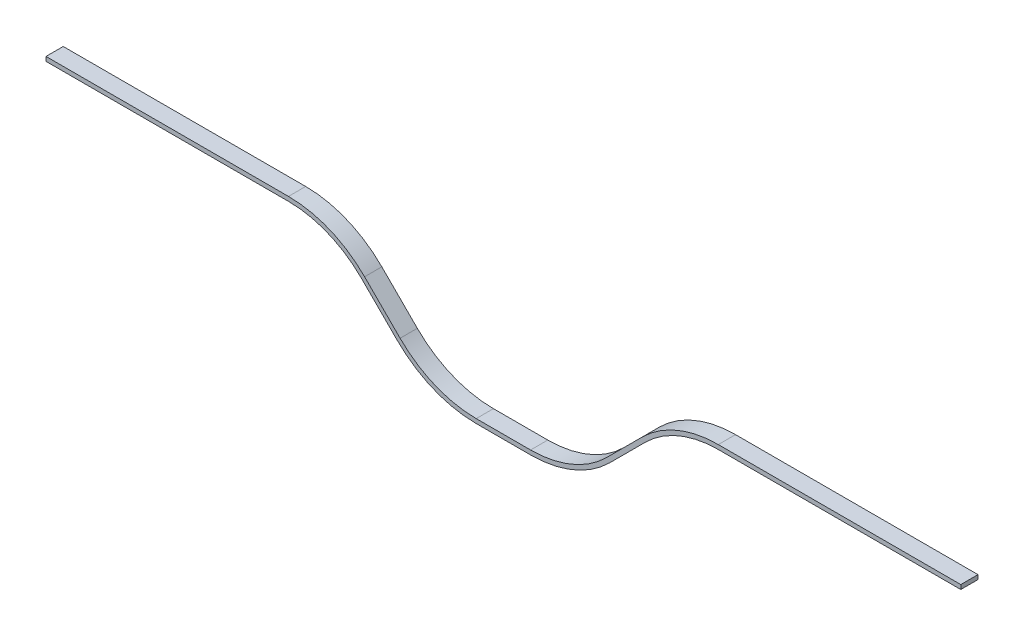
ISO-10303-21;
HEADER;
FILE_DESCRIPTION(('STEP AP214'),'2;1');
FILE_NAME('part.step','',(''),(''),'','','');
FILE_SCHEMA(('AUTOMOTIVE_DESIGN { 1 0 10303 214 1 1 1 1 }'));
ENDSEC;
DATA;
#1=APPLICATION_CONTEXT('core data for automotive mechanical design processes');
#2=APPLICATION_PROTOCOL_DEFINITION('international standard','automotive_design',2000,#1);
#3=PRODUCT_CONTEXT('',#1,'mechanical');
#4=PRODUCT('Part','Part','',(#3));
#5=PRODUCT_RELATED_PRODUCT_CATEGORY('part','',(#4));
#6=PRODUCT_DEFINITION_FORMATION('','',#4);
#7=PRODUCT_DEFINITION_CONTEXT('part definition',#1,'design');
#8=PRODUCT_DEFINITION('design','',#6,#7);
#9=PRODUCT_DEFINITION_SHAPE('','',#8);
#10=(LENGTH_UNIT() NAMED_UNIT(*) SI_UNIT(.MILLI.,.METRE.));
#11=(NAMED_UNIT(*) PLANE_ANGLE_UNIT() SI_UNIT($,.RADIAN.));
#12=(NAMED_UNIT(*) SI_UNIT($,.STERADIAN.) SOLID_ANGLE_UNIT());
#13=UNCERTAINTY_MEASURE_WITH_UNIT(LENGTH_MEASURE(1.E-05),#10,'distance_accuracy_value','');
#14=(GEOMETRIC_REPRESENTATION_CONTEXT(3) GLOBAL_UNCERTAINTY_ASSIGNED_CONTEXT((#13)) GLOBAL_UNIT_ASSIGNED_CONTEXT((#10,
#11,#12)) REPRESENTATION_CONTEXT('',''));
#15=CARTESIAN_POINT('',(0.,0.,0.));
#16=DIRECTION('',(0.,0.,1.));
#17=DIRECTION('',(1.,0.,0.));
#18=AXIS2_PLACEMENT_3D('',#15,#16,#17);
#19=CARTESIAN_POINT('',(0.,0.,120.));
#20=DIRECTION('',(1.,0.,0.));
#21=DIRECTION('',(0.,0.,-1.));
#22=AXIS2_PLACEMENT_3D('',#19,#20,#21);
#23=PLANE('',#22);
#24=DIRECTION('',(0.,-1.,0.));
#25=VECTOR('',#24,1.);
#26=CARTESIAN_POINT('',(0.,0.,0.));
#27=LINE('',#26,#25);
#28=CARTESIAN_POINT('',(0.,0.,0.));
#29=VERTEX_POINT('',#28);
#30=CARTESIAN_POINT('',(0.,-30.,0.));
#31=VERTEX_POINT('',#30);
#32=EDGE_CURVE('E200',#29,#31,#27,.T.);
#33=ORIENTED_EDGE('',*,*,#32,.T.);
#34=DIRECTION('',(0.,0.,-1.));
#35=VECTOR('',#34,1.);
#36=CARTESIAN_POINT('',(0.,-30.,120.));
#37=LINE('',#36,#35);
#38=CARTESIAN_POINT('',(0.,-30.,120.));
#39=VERTEX_POINT('',#38);
#40=EDGE_CURVE('E11',#39,#31,#37,.T.);
#41=ORIENTED_EDGE('',*,*,#40,.F.);
#42=DIRECTION('',(0.,-1.,0.));
#43=VECTOR('',#42,1.);
#44=CARTESIAN_POINT('',(0.,0.,120.));
#45=LINE('',#44,#43);
#46=CARTESIAN_POINT('',(0.,0.,120.));
#47=VERTEX_POINT('',#46);
#48=EDGE_CURVE('E238',#47,#39,#45,.T.);
#49=ORIENTED_EDGE('',*,*,#48,.F.);
#50=DIRECTION('',(0.,0.,-1.));
#51=VECTOR('',#50,1.);
#52=CARTESIAN_POINT('',(0.,0.,120.));
#53=LINE('',#52,#51);
#54=EDGE_CURVE('E196',#47,#29,#53,.T.);
#55=ORIENTED_EDGE('',*,*,#54,.T.);
#56=EDGE_LOOP('',(#33,#41,#49,#55));
#57=FACE_BOUND('',#56,.T.);
#58=ADVANCED_FACE('F32',(#57),#23,.F.);
#59=CARTESIAN_POINT('',(0.,-30.,120.));
#60=DIRECTION('',(0.,1.,0.));
#61=DIRECTION('',(0.,0.,1.));
#62=AXIS2_PLACEMENT_3D('',#59,#60,#61);
#63=PLANE('',#62);
#64=DIRECTION('',(1.,0.,0.));
#65=VECTOR('',#64,1.);
#66=CARTESIAN_POINT('',(0.,-30.,0.));
#67=LINE('',#66,#65);
#68=CARTESIAN_POINT('',(1689.33982822018,-30.,0.));
#69=VERTEX_POINT('',#68);
#70=EDGE_CURVE('E203',#31,#69,#67,.T.);
#71=ORIENTED_EDGE('',*,*,#70,.T.);
#72=DIRECTION('',(0.,0.,-1.));
#73=VECTOR('',#72,1.);
#74=CARTESIAN_POINT('',(1689.33982822018,-30.,120.));
#75=LINE('',#74,#73);
#76=CARTESIAN_POINT('',(1689.33982822018,-30.,120.));
#77=VERTEX_POINT('',#76);
#78=EDGE_CURVE('E40',#77,#69,#75,.T.);
#79=ORIENTED_EDGE('',*,*,#78,.F.);
#80=DIRECTION('',(1.,0.,0.));
#81=VECTOR('',#80,1.);
#82=CARTESIAN_POINT('',(0.,-30.,120.));
#83=LINE('',#82,#81);
#84=EDGE_CURVE('E127',#39,#77,#83,.T.);
#85=ORIENTED_EDGE('',*,*,#84,.F.);
#86=ORIENTED_EDGE('',*,*,#40,.T.);
#87=EDGE_LOOP('',(#71,#79,#85,#86));
#88=FACE_BOUND('',#87,.T.);
#89=ADVANCED_FACE('F356',(#88),#63,.F.);
#90=CARTESIAN_POINT('',(1689.33982822018,-750.,120.));
#91=DIRECTION('',(0.,0.,-1.));
#92=DIRECTION('',(-1.,0.,0.));
#93=AXIS2_PLACEMENT_3D('',#90,#91,#92);
#94=CYLINDRICAL_SURFACE('',#93,720.);
#95=CARTESIAN_POINT('',(1689.33982822018,-750.,0.));
#96=DIRECTION('',(0.,0.,-1.));
#97=DIRECTION('',(-1.,0.,0.));
#98=AXIS2_PLACEMENT_3D('',#95,#96,#97);
#99=CIRCLE('',#98,720.);
#100=CARTESIAN_POINT('',(2198.45671067449,-240.883117545686,0.));
#101=VERTEX_POINT('',#100);
#102=EDGE_CURVE('E205',#69,#101,#99,.T.);
#103=ORIENTED_EDGE('',*,*,#102,.T.);
#104=DIRECTION('',(0.,0.,-1.));
#105=VECTOR('',#104,1.);
#106=CARTESIAN_POINT('',(2198.45671067449,-240.883117545686,120.));
#107=LINE('',#106,#105);
#108=CARTESIAN_POINT('',(2198.45671067449,-240.883117545686,120.));
#109=VERTEX_POINT('',#108);
#110=EDGE_CURVE('E281',#109,#101,#107,.T.);
#111=ORIENTED_EDGE('',*,*,#110,.F.);
#112=CARTESIAN_POINT('',(1689.33982822018,-750.,120.));
#113=DIRECTION('',(0.,0.,-1.));
#114=DIRECTION('',(-1.,0.,0.));
#115=AXIS2_PLACEMENT_3D('',#112,#113,#114);
#116=CIRCLE('',#115,720.);
#117=EDGE_CURVE('E289',#77,#109,#116,.T.);
#118=ORIENTED_EDGE('',*,*,#117,.F.);
#119=ORIENTED_EDGE('',*,*,#78,.T.);
#120=EDGE_LOOP('',(#103,#111,#118,#119));
#121=FACE_BOUND('',#120,.T.);
#122=ADVANCED_FACE('F287',(#121),#94,.F.);
#123=CARTESIAN_POINT('',(2198.45671067449,-240.883117545686,120.));
#124=DIRECTION('',(0.707106781186548,0.707106781186547,0.));
#125=DIRECTION('',(-0.707106781186547,0.707106781186548,0.));
#126=AXIS2_PLACEMENT_3D('',#123,#124,#125);
#127=PLANE('',#126);
#128=DIRECTION('',(0.707106781186547,-0.707106781186548,0.));
#129=VECTOR('',#128,1.);
#130=CARTESIAN_POINT('',(2198.45671067449,-240.883117545686,0.));
#131=LINE('',#130,#129);
#132=CARTESIAN_POINT('',(2445.76276061925,-488.189167490448,0.));
#133=VERTEX_POINT('',#132);
#134=EDGE_CURVE('E207',#101,#133,#131,.T.);
#135=ORIENTED_EDGE('',*,*,#134,.T.);
#136=DIRECTION('',(0.,0.,-1.));
#137=VECTOR('',#136,1.);
#138=CARTESIAN_POINT('',(2445.76276061925,-488.189167490448,120.));
#139=LINE('',#138,#137);
#140=CARTESIAN_POINT('',(2445.76276061925,-488.189167490448,120.));
#141=VERTEX_POINT('',#140);
#142=EDGE_CURVE('E278',#141,#133,#139,.T.);
#143=ORIENTED_EDGE('',*,*,#142,.F.);
#144=DIRECTION('',(0.707106781186547,-0.707106781186548,0.));
#145=VECTOR('',#144,1.);
#146=CARTESIAN_POINT('',(2198.45671067449,-240.883117545686,120.));
#147=LINE('',#146,#145);
#148=EDGE_CURVE('E307',#109,#141,#147,.T.);
#149=ORIENTED_EDGE('',*,*,#148,.F.);
#150=ORIENTED_EDGE('',*,*,#110,.T.);
#151=EDGE_LOOP('',(#135,#143,#149,#150));
#152=FACE_BOUND('',#151,.T.);
#153=ADVANCED_FACE('F298',(#152),#127,.F.);
#154=CARTESIAN_POINT('',(2997.30604994476,63.3541218350582,120.));
#155=DIRECTION('',(0.,0.,-1.));
#156=DIRECTION('',(-1.,0.,0.));
#157=AXIS2_PLACEMENT_3D('',#154,#155,#156);
#158=CYLINDRICAL_SURFACE('',#157,780.);
#159=CARTESIAN_POINT('',(2997.30604994476,63.3541218350582,0.));
#160=DIRECTION('',(0.,0.,1.));
#161=DIRECTION('',(1.,0.,0.));
#162=AXIS2_PLACEMENT_3D('',#159,#160,#161);
#163=CIRCLE('',#162,780.);
#164=CARTESIAN_POINT('',(2997.30604994476,-716.645878164942,0.));
#165=VERTEX_POINT('',#164);
#166=EDGE_CURVE('E209',#133,#165,#163,.T.);
#167=ORIENTED_EDGE('',*,*,#166,.T.);
#168=DIRECTION('',(0.,0.,-1.));
#169=VECTOR('',#168,1.);
#170=CARTESIAN_POINT('',(2997.30604994476,-716.645878164942,120.));
#171=LINE('',#170,#169);
#172=CARTESIAN_POINT('',(2997.30604994476,-716.645878164942,120.));
#173=VERTEX_POINT('',#172);
#174=EDGE_CURVE('E275',#173,#165,#171,.T.);
#175=ORIENTED_EDGE('',*,*,#174,.F.);
#176=CARTESIAN_POINT('',(2997.30604994476,63.3541218350582,120.));
#177=DIRECTION('',(0.,0.,1.));
#178=DIRECTION('',(1.,0.,0.));
#179=AXIS2_PLACEMENT_3D('',#176,#177,#178);
#180=CIRCLE('',#179,780.);
#181=EDGE_CURVE('E304',#141,#173,#180,.T.);
#182=ORIENTED_EDGE('',*,*,#181,.F.);
#183=ORIENTED_EDGE('',*,*,#142,.T.);
#184=EDGE_LOOP('',(#167,#175,#182,#183));
#185=FACE_BOUND('',#184,.T.);
#186=ADVANCED_FACE('F302',(#185),#158,.T.);
#187=CARTESIAN_POINT('',(2997.30604994476,-716.645878164942,120.));
#188=DIRECTION('',(0.,1.,0.));
#189=DIRECTION('',(0.,0.,1.));
#190=AXIS2_PLACEMENT_3D('',#187,#188,#189);
#191=PLANE('',#190);
#192=DIRECTION('',(1.,0.,0.));
#193=VECTOR('',#192,1.);
#194=CARTESIAN_POINT('',(2997.30604994476,-716.645878164942,0.));
#195=LINE('',#194,#193);
#196=CARTESIAN_POINT('',(3375.98570638512,-716.645878164942,0.));
#197=VERTEX_POINT('',#196);
#198=EDGE_CURVE('E211',#165,#197,#195,.T.);
#199=ORIENTED_EDGE('',*,*,#198,.T.);
#200=DIRECTION('',(0.,0.,-1.));
#201=VECTOR('',#200,1.);
#202=CARTESIAN_POINT('',(3375.98570638512,-716.645878164942,120.));
#203=LINE('',#202,#201);
#204=CARTESIAN_POINT('',(3375.98570638512,-716.645878164942,120.));
#205=VERTEX_POINT('',#204);
#206=EDGE_CURVE('E272',#205,#197,#203,.T.);
#207=ORIENTED_EDGE('',*,*,#206,.F.);
#208=DIRECTION('',(1.,0.,0.));
#209=VECTOR('',#208,1.);
#210=CARTESIAN_POINT('',(2997.30604994476,-716.645878164942,120.));
#211=LINE('',#210,#209);
#212=EDGE_CURVE('E306',#173,#205,#211,.T.);
#213=ORIENTED_EDGE('',*,*,#212,.F.);
#214=ORIENTED_EDGE('',*,*,#174,.T.);
#215=EDGE_LOOP('',(#199,#207,#213,#214));
#216=FACE_BOUND('',#215,.T.);
#217=ADVANCED_FACE('F369',(#216),#191,.F.);
#218=CARTESIAN_POINT('',(3375.98570638512,63.3541218350582,120.));
#219=DIRECTION('',(0.,0.,-1.));
#220=DIRECTION('',(-1.,0.,0.));
#221=AXIS2_PLACEMENT_3D('',#218,#219,#220);
#222=CYLINDRICAL_SURFACE('',#221,780.);
#223=CARTESIAN_POINT('',(3375.98570638512,63.3541218350582,0.));
#224=DIRECTION('',(0.,0.,1.));
#225=DIRECTION('',(1.,0.,0.));
#226=AXIS2_PLACEMENT_3D('',#223,#224,#225);
#227=CIRCLE('',#226,780.);
#228=CARTESIAN_POINT('',(3927.52899571063,-488.189167490448,0.));
#229=VERTEX_POINT('',#228);
#230=EDGE_CURVE('E213',#197,#229,#227,.T.);
#231=ORIENTED_EDGE('',*,*,#230,.T.);
#232=DIRECTION('',(0.,0.,-1.));
#233=VECTOR('',#232,1.);
#234=CARTESIAN_POINT('',(3927.52899571063,-488.189167490448,120.));
#235=LINE('',#234,#233);
#236=CARTESIAN_POINT('',(3927.52899571063,-488.189167490448,120.));
#237=VERTEX_POINT('',#236);
#238=EDGE_CURVE('E269',#237,#229,#235,.T.);
#239=ORIENTED_EDGE('',*,*,#238,.F.);
#240=CARTESIAN_POINT('',(3375.98570638512,63.3541218350582,120.));
#241=DIRECTION('',(0.,0.,1.));
#242=DIRECTION('',(1.,0.,0.));
#243=AXIS2_PLACEMENT_3D('',#240,#241,#242);
#244=CIRCLE('',#243,780.);
#245=EDGE_CURVE('E309',#205,#237,#244,.T.);
#246=ORIENTED_EDGE('',*,*,#245,.F.);
#247=ORIENTED_EDGE('',*,*,#206,.T.);
#248=EDGE_LOOP('',(#231,#239,#246,#247));
#249=FACE_BOUND('',#248,.T.);
#250=ADVANCED_FACE('F372',(#249),#222,.T.);
#251=CARTESIAN_POINT('',(3927.52899571063,-488.189167490448,120.));
#252=DIRECTION('',(-0.707106781186549,0.707106781186546,0.));
#253=DIRECTION('',(-0.707106781186546,-0.707106781186549,0.));
#254=AXIS2_PLACEMENT_3D('',#251,#252,#253);
#255=PLANE('',#254);
#256=DIRECTION('',(0.707106781186546,0.707106781186549,0.));
#257=VECTOR('',#256,1.);
#258=CARTESIAN_POINT('',(3927.52899571063,-488.189167490448,0.));
#259=LINE('',#258,#257);
#260=CARTESIAN_POINT('',(4174.83504565539,-240.883117545687,0.));
#261=VERTEX_POINT('',#260);
#262=EDGE_CURVE('E215',#229,#261,#259,.T.);
#263=ORIENTED_EDGE('',*,*,#262,.T.);
#264=DIRECTION('',(0.,0.,-1.));
#265=VECTOR('',#264,1.);
#266=CARTESIAN_POINT('',(4174.83504565539,-240.883117545687,120.));
#267=LINE('',#266,#265);
#268=CARTESIAN_POINT('',(4174.83504565539,-240.883117545687,120.));
#269=VERTEX_POINT('',#268);
#270=EDGE_CURVE('E266',#269,#261,#267,.T.);
#271=ORIENTED_EDGE('',*,*,#270,.F.);
#272=DIRECTION('',(0.707106781186546,0.707106781186549,0.));
#273=VECTOR('',#272,1.);
#274=CARTESIAN_POINT('',(3927.52899571063,-488.189167490448,120.));
#275=LINE('',#274,#273);
#276=EDGE_CURVE('E315',#237,#269,#275,.T.);
#277=ORIENTED_EDGE('',*,*,#276,.F.);
#278=ORIENTED_EDGE('',*,*,#238,.T.);
#279=EDGE_LOOP('',(#263,#271,#277,#278));
#280=FACE_BOUND('',#279,.T.);
#281=ADVANCED_FACE('F376',(#280),#255,.F.);
#282=CARTESIAN_POINT('',(4683.9519281097,-750.,120.));
#283=DIRECTION('',(0.,0.,-1.));
#284=DIRECTION('',(-1.,0.,0.));
#285=AXIS2_PLACEMENT_3D('',#282,#283,#284);
#286=CYLINDRICAL_SURFACE('',#285,720.);
#287=CARTESIAN_POINT('',(4683.9519281097,-750.,0.));
#288=DIRECTION('',(0.,0.,-1.));
#289=DIRECTION('',(-1.,0.,0.));
#290=AXIS2_PLACEMENT_3D('',#287,#288,#289);
#291=CIRCLE('',#290,720.);
#292=CARTESIAN_POINT('',(4683.9519281097,-30.,0.));
#293=VERTEX_POINT('',#292);
#294=EDGE_CURVE('E217',#261,#293,#291,.T.);
#295=ORIENTED_EDGE('',*,*,#294,.T.);
#296=DIRECTION('',(0.,0.,-1.));
#297=VECTOR('',#296,1.);
#298=CARTESIAN_POINT('',(4683.9519281097,-30.,120.));
#299=LINE('',#298,#297);
#300=CARTESIAN_POINT('',(4683.9519281097,-30.,120.));
#301=VERTEX_POINT('',#300);
#302=EDGE_CURVE('E263',#301,#293,#299,.T.);
#303=ORIENTED_EDGE('',*,*,#302,.F.);
#304=CARTESIAN_POINT('',(4683.9519281097,-750.,120.));
#305=DIRECTION('',(0.,0.,-1.));
#306=DIRECTION('',(-1.,0.,0.));
#307=AXIS2_PLACEMENT_3D('',#304,#305,#306);
#308=CIRCLE('',#307,720.);
#309=EDGE_CURVE('E317',#269,#301,#308,.T.);
#310=ORIENTED_EDGE('',*,*,#309,.F.);
#311=ORIENTED_EDGE('',*,*,#270,.T.);
#312=EDGE_LOOP('',(#295,#303,#310,#311));
#313=FACE_BOUND('',#312,.T.);
#314=ADVANCED_FACE('F380',(#313),#286,.F.);
#315=CARTESIAN_POINT('',(4683.9519281097,-30.,120.));
#316=DIRECTION('',(0.,1.,0.));
#317=DIRECTION('',(-1.,0.,0.));
#318=AXIS2_PLACEMENT_3D('',#315,#316,#317);
#319=PLANE('',#318);
#320=DIRECTION('',(1.,0.,0.));
#321=VECTOR('',#320,1.);
#322=CARTESIAN_POINT('',(4683.9519281097,-30.,0.));
#323=LINE('',#322,#321);
#324=CARTESIAN_POINT('',(6373.29175632988,-30.,0.));
#325=VERTEX_POINT('',#324);
#326=EDGE_CURVE('E219',#293,#325,#323,.T.);
#327=ORIENTED_EDGE('',*,*,#326,.T.);
#328=DIRECTION('',(0.,0.,-1.));
#329=VECTOR('',#328,1.);
#330=CARTESIAN_POINT('',(6373.29175632988,-30.,120.));
#331=LINE('',#330,#329);
#332=CARTESIAN_POINT('',(6373.29175632988,-30.,120.));
#333=VERTEX_POINT('',#332);
#334=EDGE_CURVE('E260',#333,#325,#331,.T.);
#335=ORIENTED_EDGE('',*,*,#334,.F.);
#336=DIRECTION('',(1.,0.,0.));
#337=VECTOR('',#336,1.);
#338=CARTESIAN_POINT('',(4683.9519281097,-30.,120.));
#339=LINE('',#338,#337);
#340=EDGE_CURVE('E319',#301,#333,#339,.T.);
#341=ORIENTED_EDGE('',*,*,#340,.F.);
#342=ORIENTED_EDGE('',*,*,#302,.T.);
#343=EDGE_LOOP('',(#327,#335,#341,#342));
#344=FACE_BOUND('',#343,.T.);
#345=ADVANCED_FACE('F384',(#344),#319,.F.);
#346=CARTESIAN_POINT('',(6373.29175632988,0.,120.));
#347=DIRECTION('',(-1.,0.,0.));
#348=DIRECTION('',(0.,0.,1.));
#349=AXIS2_PLACEMENT_3D('',#346,#347,#348);
#350=PLANE('',#349);
#351=DIRECTION('',(0.,1.,0.));
#352=VECTOR('',#351,1.);
#353=CARTESIAN_POINT('',(6373.29175632988,0.,0.));
#354=LINE('',#353,#352);
#355=CARTESIAN_POINT('',(6373.29175632988,0.,0.));
#356=VERTEX_POINT('',#355);
#357=EDGE_CURVE('E221',#325,#356,#354,.T.);
#358=ORIENTED_EDGE('',*,*,#357,.T.);
#359=DIRECTION('',(0.,0.,-1.));
#360=VECTOR('',#359,1.);
#361=CARTESIAN_POINT('',(6373.29175632988,0.,120.));
#362=LINE('',#361,#360);
#363=CARTESIAN_POINT('',(6373.29175632988,0.,120.));
#364=VERTEX_POINT('',#363);
#365=EDGE_CURVE('E257',#364,#356,#362,.T.);
#366=ORIENTED_EDGE('',*,*,#365,.F.);
#367=DIRECTION('',(0.,1.,0.));
#368=VECTOR('',#367,1.);
#369=CARTESIAN_POINT('',(6373.29175632988,0.,120.));
#370=LINE('',#369,#368);
#371=EDGE_CURVE('E321',#333,#364,#370,.T.);
#372=ORIENTED_EDGE('',*,*,#371,.F.);
#373=ORIENTED_EDGE('',*,*,#334,.T.);
#374=EDGE_LOOP('',(#358,#366,#372,#373));
#375=FACE_BOUND('',#374,.T.);
#376=ADVANCED_FACE('F388',(#375),#350,.F.);
#377=CARTESIAN_POINT('',(4683.9519281097,0.,120.));
#378=DIRECTION('',(0.,-1.,0.));
#379=DIRECTION('',(1.,0.,0.));
#380=AXIS2_PLACEMENT_3D('',#377,#378,#379);
#381=PLANE('',#380);
#382=DIRECTION('',(-1.,0.,0.));
#383=VECTOR('',#382,1.);
#384=CARTESIAN_POINT('',(4683.9519281097,0.,0.));
#385=LINE('',#384,#383);
#386=CARTESIAN_POINT('',(4683.9519281097,4.44089209850063E-13,0.));
#387=VERTEX_POINT('',#386);
#388=EDGE_CURVE('E223',#356,#387,#385,.T.);
#389=ORIENTED_EDGE('',*,*,#388,.T.);
#390=DIRECTION('',(0.,0.,-1.));
#391=VECTOR('',#390,1.);
#392=CARTESIAN_POINT('',(4683.9519281097,4.44089209850063E-13,120.));
#393=LINE('',#392,#391);
#394=CARTESIAN_POINT('',(4683.9519281097,4.44089209850063E-13,120.));
#395=VERTEX_POINT('',#394);
#396=EDGE_CURVE('E254',#395,#387,#393,.T.);
#397=ORIENTED_EDGE('',*,*,#396,.F.);
#398=DIRECTION('',(-1.,0.,0.));
#399=VECTOR('',#398,1.);
#400=CARTESIAN_POINT('',(4683.9519281097,0.,120.));
#401=LINE('',#400,#399);
#402=EDGE_CURVE('E323',#364,#395,#401,.T.);
#403=ORIENTED_EDGE('',*,*,#402,.F.);
#404=ORIENTED_EDGE('',*,*,#365,.T.);
#405=EDGE_LOOP('',(#389,#397,#403,#404));
#406=FACE_BOUND('',#405,.T.);
#407=ADVANCED_FACE('F392',(#406),#381,.F.);
#408=CARTESIAN_POINT('',(4683.9519281097,-750.,120.));
#409=DIRECTION('',(0.,0.,-1.));
#410=DIRECTION('',(-1.,0.,0.));
#411=AXIS2_PLACEMENT_3D('',#408,#409,#410);
#412=CYLINDRICAL_SURFACE('',#411,750.);
#413=CARTESIAN_POINT('',(4683.9519281097,-750.,0.));
#414=DIRECTION('',(0.,0.,1.));
#415=DIRECTION('',(-1.,0.,0.));
#416=AXIS2_PLACEMENT_3D('',#413,#414,#415);
#417=CIRCLE('',#416,750.);
#418=CARTESIAN_POINT('',(4153.62184221979,-219.66991411009,0.));
#419=VERTEX_POINT('',#418);
#420=EDGE_CURVE('E225',#387,#419,#417,.T.);
#421=ORIENTED_EDGE('',*,*,#420,.T.);
#422=DIRECTION('',(0.,0.,-1.));
#423=VECTOR('',#422,1.);
#424=CARTESIAN_POINT('',(4153.62184221979,-219.66991411009,120.));
#425=LINE('',#424,#423);
#426=CARTESIAN_POINT('',(4153.62184221979,-219.66991411009,120.));
#427=VERTEX_POINT('',#426);
#428=EDGE_CURVE('E251',#427,#419,#425,.T.);
#429=ORIENTED_EDGE('',*,*,#428,.F.);
#430=CARTESIAN_POINT('',(4683.9519281097,-750.,120.));
#431=DIRECTION('',(0.,0.,1.));
#432=DIRECTION('',(-1.,0.,0.));
#433=AXIS2_PLACEMENT_3D('',#430,#431,#432);
#434=CIRCLE('',#433,750.);
#435=EDGE_CURVE('E325',#395,#427,#434,.T.);
#436=ORIENTED_EDGE('',*,*,#435,.F.);
#437=ORIENTED_EDGE('',*,*,#396,.T.);
#438=EDGE_LOOP('',(#421,#429,#436,#437));
#439=FACE_BOUND('',#438,.T.);
#440=ADVANCED_FACE('F396',(#439),#412,.T.);
#441=CARTESIAN_POINT('',(3906.31579227503,-466.975964054851,120.));
#442=DIRECTION('',(0.70710678118655,-0.707106781186545,0.));
#443=DIRECTION('',(0.707106781186545,0.70710678118655,0.));
#444=AXIS2_PLACEMENT_3D('',#441,#442,#443);
#445=PLANE('',#444);
#446=DIRECTION('',(-0.707106781186546,-0.70710678118655,0.));
#447=VECTOR('',#446,1.);
#448=CARTESIAN_POINT('',(3906.31579227503,-466.975964054851,0.));
#449=LINE('',#448,#447);
#450=CARTESIAN_POINT('',(3906.31579227503,-466.975964054851,0.));
#451=VERTEX_POINT('',#450);
#452=EDGE_CURVE('E227',#419,#451,#449,.T.);
#453=ORIENTED_EDGE('',*,*,#452,.T.);
#454=DIRECTION('',(0.,0.,-1.));
#455=VECTOR('',#454,1.);
#456=CARTESIAN_POINT('',(3906.31579227503,-466.975964054851,120.));
#457=LINE('',#456,#455);
#458=CARTESIAN_POINT('',(3906.31579227503,-466.975964054851,120.));
#459=VERTEX_POINT('',#458);
#460=EDGE_CURVE('E248',#459,#451,#457,.T.);
#461=ORIENTED_EDGE('',*,*,#460,.F.);
#462=DIRECTION('',(-0.707106781186546,-0.70710678118655,0.));
#463=VECTOR('',#462,1.);
#464=CARTESIAN_POINT('',(3906.31579227503,-466.975964054851,120.));
#465=LINE('',#464,#463);
#466=EDGE_CURVE('E327',#427,#459,#465,.T.);
#467=ORIENTED_EDGE('',*,*,#466,.F.);
#468=ORIENTED_EDGE('',*,*,#428,.T.);
#469=EDGE_LOOP('',(#453,#461,#467,#468));
#470=FACE_BOUND('',#469,.T.);
#471=ADVANCED_FACE('F400',(#470),#445,.F.);
#472=CARTESIAN_POINT('',(3375.98570638512,63.3541218350582,120.));
#473=DIRECTION('',(0.,0.,-1.));
#474=DIRECTION('',(-1.,0.,0.));
#475=AXIS2_PLACEMENT_3D('',#472,#473,#474);
#476=CYLINDRICAL_SURFACE('',#475,750.);
#477=CARTESIAN_POINT('',(3375.98570638512,63.3541218350582,0.));
#478=DIRECTION('',(0.,0.,-1.));
#479=DIRECTION('',(1.,0.,0.));
#480=AXIS2_PLACEMENT_3D('',#477,#478,#479);
#481=CIRCLE('',#480,750.);
#482=CARTESIAN_POINT('',(3375.98570638512,-686.645878164942,0.));
#483=VERTEX_POINT('',#482);
#484=EDGE_CURVE('E229',#451,#483,#481,.T.);
#485=ORIENTED_EDGE('',*,*,#484,.T.);
#486=DIRECTION('',(0.,0.,-1.));
#487=VECTOR('',#486,1.);
#488=CARTESIAN_POINT('',(3375.98570638512,-686.645878164942,120.));
#489=LINE('',#488,#487);
#490=CARTESIAN_POINT('',(3375.98570638512,-686.645878164942,120.));
#491=VERTEX_POINT('',#490);
#492=EDGE_CURVE('E245',#491,#483,#489,.T.);
#493=ORIENTED_EDGE('',*,*,#492,.F.);
#494=CARTESIAN_POINT('',(3375.98570638512,63.3541218350582,120.));
#495=DIRECTION('',(0.,0.,-1.));
#496=DIRECTION('',(1.,0.,0.));
#497=AXIS2_PLACEMENT_3D('',#494,#495,#496);
#498=CIRCLE('',#497,750.);
#499=EDGE_CURVE('E329',#459,#491,#498,.T.);
#500=ORIENTED_EDGE('',*,*,#499,.F.);
#501=ORIENTED_EDGE('',*,*,#460,.T.);
#502=EDGE_LOOP('',(#485,#493,#500,#501));
#503=FACE_BOUND('',#502,.T.);
#504=ADVANCED_FACE('F404',(#503),#476,.F.);
#505=CARTESIAN_POINT('',(2997.30604994476,-686.645878164942,120.));
#506=DIRECTION('',(0.,-1.,0.));
#507=DIRECTION('',(0.,0.,-1.));
#508=AXIS2_PLACEMENT_3D('',#505,#506,#507);
#509=PLANE('',#508);
#510=DIRECTION('',(-1.,0.,0.));
#511=VECTOR('',#510,1.);
#512=CARTESIAN_POINT('',(2997.30604994476,-686.645878164942,0.));
#513=LINE('',#512,#511);
#514=CARTESIAN_POINT('',(2997.30604994476,-686.645878164942,0.));
#515=VERTEX_POINT('',#514);
#516=EDGE_CURVE('E231',#483,#515,#513,.T.);
#517=ORIENTED_EDGE('',*,*,#516,.T.);
#518=DIRECTION('',(0.,0.,-1.));
#519=VECTOR('',#518,1.);
#520=CARTESIAN_POINT('',(2997.30604994476,-686.645878164942,120.));
#521=LINE('',#520,#519);
#522=CARTESIAN_POINT('',(2997.30604994476,-686.645878164942,120.));
#523=VERTEX_POINT('',#522);
#524=EDGE_CURVE('E242',#523,#515,#521,.T.);
#525=ORIENTED_EDGE('',*,*,#524,.F.);
#526=DIRECTION('',(-1.,0.,0.));
#527=VECTOR('',#526,1.);
#528=CARTESIAN_POINT('',(2997.30604994476,-686.645878164942,120.));
#529=LINE('',#528,#527);
#530=EDGE_CURVE('E331',#491,#523,#529,.T.);
#531=ORIENTED_EDGE('',*,*,#530,.F.);
#532=ORIENTED_EDGE('',*,*,#492,.T.);
#533=EDGE_LOOP('',(#517,#525,#531,#532));
#534=FACE_BOUND('',#533,.T.);
#535=ADVANCED_FACE('F337',(#534),#509,.F.);
#536=CARTESIAN_POINT('',(2997.30604994476,63.3541218350582,120.));
#537=DIRECTION('',(0.,0.,-1.));
#538=DIRECTION('',(-1.,0.,0.));
#539=AXIS2_PLACEMENT_3D('',#536,#537,#538);
#540=CYLINDRICAL_SURFACE('',#539,750.);
#541=CARTESIAN_POINT('',(2997.30604994476,63.3541218350582,0.));
#542=DIRECTION('',(0.,0.,-1.));
#543=DIRECTION('',(1.,0.,0.));
#544=AXIS2_PLACEMENT_3D('',#541,#542,#543);
#545=CIRCLE('',#544,750.);
#546=CARTESIAN_POINT('',(2466.97596405485,-466.975964054852,0.));
#547=VERTEX_POINT('',#546);
#548=EDGE_CURVE('E233',#515,#547,#545,.T.);
#549=ORIENTED_EDGE('',*,*,#548,.T.);
#550=DIRECTION('',(0.,0.,-1.));
#551=VECTOR('',#550,1.);
#552=CARTESIAN_POINT('',(2466.97596405485,-466.975964054852,120.));
#553=LINE('',#552,#551);
#554=CARTESIAN_POINT('',(2466.97596405485,-466.975964054852,120.));
#555=VERTEX_POINT('',#554);
#556=EDGE_CURVE('E191',#555,#547,#553,.T.);
#557=ORIENTED_EDGE('',*,*,#556,.F.);
#558=CARTESIAN_POINT('',(2997.30604994476,63.3541218350582,120.));
#559=DIRECTION('',(0.,0.,-1.));
#560=DIRECTION('',(1.,0.,0.));
#561=AXIS2_PLACEMENT_3D('',#558,#559,#560);
#562=CIRCLE('',#561,750.);
#563=EDGE_CURVE('E182',#523,#555,#562,.T.);
#564=ORIENTED_EDGE('',*,*,#563,.F.);
#565=ORIENTED_EDGE('',*,*,#524,.T.);
#566=EDGE_LOOP('',(#549,#557,#564,#565));
#567=FACE_BOUND('',#566,.T.);
#568=ADVANCED_FACE('F341',(#567),#540,.F.);
#569=CARTESIAN_POINT('',(2219.66991411009,-219.66991411009,120.));
#570=DIRECTION('',(-0.707106781186549,-0.707106781186546,0.));
#571=DIRECTION('',(0.707106781186546,-0.707106781186549,0.));
#572=AXIS2_PLACEMENT_3D('',#569,#570,#571);
#573=PLANE('',#572);
#574=DIRECTION('',(-0.707106781186546,0.707106781186549,0.));
#575=VECTOR('',#574,1.);
#576=CARTESIAN_POINT('',(2219.66991411009,-219.66991411009,0.));
#577=LINE('',#576,#575);
#578=CARTESIAN_POINT('',(2219.66991411009,-219.66991411009,0.));
#579=VERTEX_POINT('',#578);
#580=EDGE_CURVE('E190',#547,#579,#577,.T.);
#581=ORIENTED_EDGE('',*,*,#580,.T.);
#582=DIRECTION('',(0.,0.,-1.));
#583=VECTOR('',#582,1.);
#584=CARTESIAN_POINT('',(2219.66991411009,-219.66991411009,120.));
#585=LINE('',#584,#583);
#586=CARTESIAN_POINT('',(2219.66991411009,-219.66991411009,120.));
#587=VERTEX_POINT('',#586);
#588=EDGE_CURVE('E187',#587,#579,#585,.T.);
#589=ORIENTED_EDGE('',*,*,#588,.F.);
#590=DIRECTION('',(-0.707106781186546,0.707106781186549,0.));
#591=VECTOR('',#590,1.);
#592=CARTESIAN_POINT('',(2219.66991411009,-219.66991411009,120.));
#593=LINE('',#592,#591);
#594=EDGE_CURVE('E176',#555,#587,#593,.T.);
#595=ORIENTED_EDGE('',*,*,#594,.F.);
#596=ORIENTED_EDGE('',*,*,#556,.T.);
#597=EDGE_LOOP('',(#581,#589,#595,#596));
#598=FACE_BOUND('',#597,.T.);
#599=ADVANCED_FACE('F188',(#598),#573,.F.);
#600=CARTESIAN_POINT('',(1689.33982822018,-750.,120.));
#601=DIRECTION('',(0.,0.,-1.));
#602=DIRECTION('',(-1.,0.,0.));
#603=AXIS2_PLACEMENT_3D('',#600,#601,#602);
#604=CYLINDRICAL_SURFACE('',#603,750.);
#605=CARTESIAN_POINT('',(1689.33982822018,-750.,0.));
#606=DIRECTION('',(0.,0.,1.));
#607=DIRECTION('',(-1.,0.,0.));
#608=AXIS2_PLACEMENT_3D('',#605,#606,#607);
#609=CIRCLE('',#608,750.);
#610=CARTESIAN_POINT('',(1689.33982822018,0.,0.));
#611=VERTEX_POINT('',#610);
#612=EDGE_CURVE('E113',#579,#611,#609,.T.);
#613=ORIENTED_EDGE('',*,*,#612,.T.);
#614=DIRECTION('',(0.,0.,-1.));
#615=VECTOR('',#614,1.);
#616=CARTESIAN_POINT('',(1689.33982822018,0.,120.));
#617=LINE('',#616,#615);
#618=CARTESIAN_POINT('',(1689.33982822018,0.,120.));
#619=VERTEX_POINT('',#618);
#620=EDGE_CURVE('E192',#619,#611,#617,.T.);
#621=ORIENTED_EDGE('',*,*,#620,.F.);
#622=CARTESIAN_POINT('',(1689.33982822018,-750.,120.));
#623=DIRECTION('',(0.,0.,1.));
#624=DIRECTION('',(-1.,0.,0.));
#625=AXIS2_PLACEMENT_3D('',#622,#623,#624);
#626=CIRCLE('',#625,750.);
#627=EDGE_CURVE('E180',#587,#619,#626,.T.);
#628=ORIENTED_EDGE('',*,*,#627,.F.);
#629=ORIENTED_EDGE('',*,*,#588,.T.);
#630=EDGE_LOOP('',(#613,#621,#628,#629));
#631=FACE_BOUND('',#630,.T.);
#632=ADVANCED_FACE('F194',(#631),#604,.T.);
#633=CARTESIAN_POINT('',(0.,0.,120.));
#634=DIRECTION('',(0.,-1.,0.));
#635=DIRECTION('',(1.,0.,0.));
#636=AXIS2_PLACEMENT_3D('',#633,#634,#635);
#637=PLANE('',#636);
#638=DIRECTION('',(-1.,0.,0.));
#639=VECTOR('',#638,1.);
#640=CARTESIAN_POINT('',(0.,0.,0.));
#641=LINE('',#640,#639);
#642=EDGE_CURVE('E119',#611,#29,#641,.T.);
#643=ORIENTED_EDGE('',*,*,#642,.T.);
#644=ORIENTED_EDGE('',*,*,#54,.F.);
#645=DIRECTION('',(-1.,0.,0.));
#646=VECTOR('',#645,1.);
#647=CARTESIAN_POINT('',(0.,0.,120.));
#648=LINE('',#647,#646);
#649=EDGE_CURVE('E48',#619,#47,#648,.T.);
#650=ORIENTED_EDGE('',*,*,#649,.F.);
#651=ORIENTED_EDGE('',*,*,#620,.T.);
#652=EDGE_LOOP('',(#643,#644,#650,#651));
#653=FACE_BOUND('',#652,.T.);
#654=ADVANCED_FACE('F345',(#653),#637,.F.);
#655=CARTESIAN_POINT('',(1689.33982822018,-750.,120.));
#656=DIRECTION('',(0.,0.,-1.));
#657=DIRECTION('',(-1.,0.,0.));
#658=AXIS2_PLACEMENT_3D('',#655,#656,#657);
#659=PLANE('',#658);
#660=ORIENTED_EDGE('',*,*,#48,.T.);
#661=ORIENTED_EDGE('',*,*,#84,.T.);
#662=ORIENTED_EDGE('',*,*,#117,.T.);
#663=ORIENTED_EDGE('',*,*,#148,.T.);
#664=ORIENTED_EDGE('',*,*,#181,.T.);
#665=ORIENTED_EDGE('',*,*,#212,.T.);
#666=ORIENTED_EDGE('',*,*,#245,.T.);
#667=ORIENTED_EDGE('',*,*,#276,.T.);
#668=ORIENTED_EDGE('',*,*,#309,.T.);
#669=ORIENTED_EDGE('',*,*,#340,.T.);
#670=ORIENTED_EDGE('',*,*,#371,.T.);
#671=ORIENTED_EDGE('',*,*,#402,.T.);
#672=ORIENTED_EDGE('',*,*,#435,.T.);
#673=ORIENTED_EDGE('',*,*,#466,.T.);
#674=ORIENTED_EDGE('',*,*,#499,.T.);
#675=ORIENTED_EDGE('',*,*,#530,.T.);
#676=ORIENTED_EDGE('',*,*,#563,.T.);
#677=ORIENTED_EDGE('',*,*,#594,.T.);
#678=ORIENTED_EDGE('',*,*,#627,.T.);
#679=ORIENTED_EDGE('',*,*,#649,.T.);
#680=EDGE_LOOP('',(#660,#661,#662,#663,#664,#665,#666,#667,#668,#669,#670,#671,#672,#673,#674,
#675,#676,#677,#678,#679));
#681=FACE_BOUND('',#680,.T.);
#682=ADVANCED_FACE('F178',(#681),#659,.F.);
#683=CARTESIAN_POINT('',(1689.33982822018,-750.,0.));
#684=DIRECTION('',(0.,0.,-1.));
#685=DIRECTION('',(-1.,0.,0.));
#686=AXIS2_PLACEMENT_3D('',#683,#684,#685);
#687=PLANE('',#686);
#688=ORIENTED_EDGE('',*,*,#32,.F.);
#689=ORIENTED_EDGE('',*,*,#642,.F.);
#690=ORIENTED_EDGE('',*,*,#612,.F.);
#691=ORIENTED_EDGE('',*,*,#580,.F.);
#692=ORIENTED_EDGE('',*,*,#548,.F.);
#693=ORIENTED_EDGE('',*,*,#516,.F.);
#694=ORIENTED_EDGE('',*,*,#484,.F.);
#695=ORIENTED_EDGE('',*,*,#452,.F.);
#696=ORIENTED_EDGE('',*,*,#420,.F.);
#697=ORIENTED_EDGE('',*,*,#388,.F.);
#698=ORIENTED_EDGE('',*,*,#357,.F.);
#699=ORIENTED_EDGE('',*,*,#326,.F.);
#700=ORIENTED_EDGE('',*,*,#294,.F.);
#701=ORIENTED_EDGE('',*,*,#262,.F.);
#702=ORIENTED_EDGE('',*,*,#230,.F.);
#703=ORIENTED_EDGE('',*,*,#198,.F.);
#704=ORIENTED_EDGE('',*,*,#166,.F.);
#705=ORIENTED_EDGE('',*,*,#134,.F.);
#706=ORIENTED_EDGE('',*,*,#102,.F.);
#707=ORIENTED_EDGE('',*,*,#70,.F.);
#708=EDGE_LOOP('',(#688,#689,#690,#691,#692,#693,#694,#695,#696,#697,#698,#699,#700,#701,#702,
#703,#704,#705,#706,#707));
#709=FACE_BOUND('',#708,.T.);
#710=ADVANCED_FACE('F293',(#709),#687,.T.);
#711=CLOSED_SHELL('',(#58,#89,#122,#153,#186,#217,#250,#281,#314,#345,#376,#407,#440,#471,#504,
#535,#568,#599,#632,#654,#682,#710));
#712=MANIFOLD_SOLID_BREP('B2',#711);
#713=ADVANCED_BREP_SHAPE_REPRESENTATION('',(#18,#712),#14);
#714=SHAPE_DEFINITION_REPRESENTATION(#9,#713);
ENDSEC;
END-ISO-10303-21;
